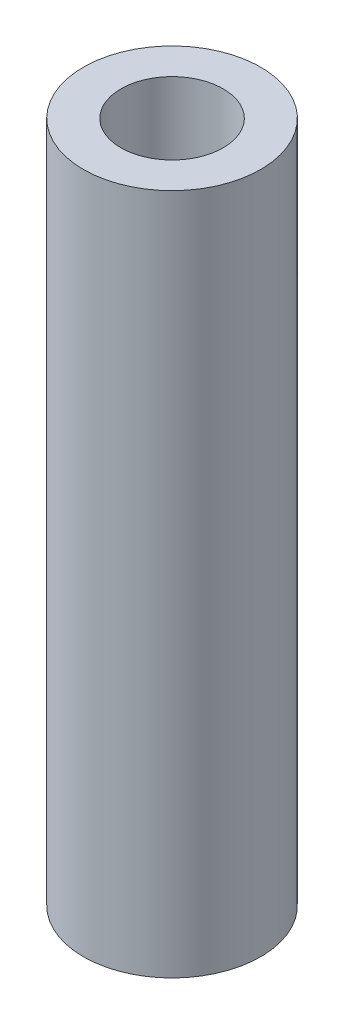
ISO-10303-21;
HEADER;
FILE_DESCRIPTION(('STEP AP214'),'2;1');
FILE_NAME('part.step','',(''),(''),'','','');
FILE_SCHEMA(('AUTOMOTIVE_DESIGN { 1 0 10303 214 1 1 1 1 }'));
ENDSEC;
DATA;
#1=APPLICATION_CONTEXT('core data for automotive mechanical design processes');
#2=APPLICATION_PROTOCOL_DEFINITION('international standard','automotive_design',2000,#1);
#3=PRODUCT_CONTEXT('',#1,'mechanical');
#4=PRODUCT('Part','Part','',(#3));
#5=PRODUCT_RELATED_PRODUCT_CATEGORY('part','',(#4));
#6=PRODUCT_DEFINITION_FORMATION('','',#4);
#7=PRODUCT_DEFINITION_CONTEXT('part definition',#1,'design');
#8=PRODUCT_DEFINITION('design','',#6,#7);
#9=PRODUCT_DEFINITION_SHAPE('','',#8);
#10=(LENGTH_UNIT() NAMED_UNIT(*) SI_UNIT(.MILLI.,.METRE.));
#11=(NAMED_UNIT(*) PLANE_ANGLE_UNIT() SI_UNIT($,.RADIAN.));
#12=(NAMED_UNIT(*) SI_UNIT($,.STERADIAN.) SOLID_ANGLE_UNIT());
#13=UNCERTAINTY_MEASURE_WITH_UNIT(LENGTH_MEASURE(1.E-05),#10,'distance_accuracy_value','');
#14=(GEOMETRIC_REPRESENTATION_CONTEXT(3) GLOBAL_UNCERTAINTY_ASSIGNED_CONTEXT((#13)) GLOBAL_UNIT_ASSIGNED_CONTEXT((#10,
#11,#12)) REPRESENTATION_CONTEXT('',''));
#15=CARTESIAN_POINT('',(0.,0.,0.));
#16=DIRECTION('',(0.,0.,1.));
#17=DIRECTION('',(1.,0.,0.));
#18=AXIS2_PLACEMENT_3D('',#15,#16,#17);
#19=CARTESIAN_POINT('',(0.,20.,0.));
#20=DIRECTION('',(0.,1.,0.));
#21=DIRECTION('',(0.,0.,1.));
#22=AXIS2_PLACEMENT_3D('',#19,#20,#21);
#23=PLANE('',#22);
#24=CARTESIAN_POINT('',(0.,20.,0.));
#25=DIRECTION('',(0.,1.,0.));
#26=DIRECTION('',(0.,0.,1.));
#27=AXIS2_PLACEMENT_3D('',#24,#25,#26);
#28=CIRCLE('',#27,2.6);
#29=CARTESIAN_POINT('',(0.,20.,2.6));
#30=VERTEX_POINT('',#29);
#31=EDGE_CURVE('E10',#30,#30,#28,.T.);
#32=ORIENTED_EDGE('',*,*,#31,.T.);
#33=EDGE_LOOP('',(#32));
#34=FACE_BOUND('',#33,.T.);
#35=CARTESIAN_POINT('',(0.,20.,0.));
#36=DIRECTION('',(0.,1.,0.));
#37=DIRECTION('',(0.,0.,1.));
#38=AXIS2_PLACEMENT_3D('',#35,#36,#37);
#39=CIRCLE('',#38,1.5);
#40=CARTESIAN_POINT('',(0.,20.,1.5));
#41=VERTEX_POINT('',#40);
#42=EDGE_CURVE('E54',#41,#41,#39,.T.);
#43=ORIENTED_EDGE('',*,*,#42,.F.);
#44=EDGE_LOOP('',(#43));
#45=FACE_BOUND('',#44,.T.);
#46=ADVANCED_FACE('F43',(#34,#45),#23,.T.);
#47=CARTESIAN_POINT('',(0.,0.,0.));
#48=DIRECTION('',(0.,1.,0.));
#49=DIRECTION('',(0.,0.,1.));
#50=AXIS2_PLACEMENT_3D('',#47,#48,#49);
#51=PLANE('',#50);
#52=CARTESIAN_POINT('',(0.,0.,0.));
#53=DIRECTION('',(0.,1.,0.));
#54=DIRECTION('',(0.,0.,1.));
#55=AXIS2_PLACEMENT_3D('',#52,#53,#54);
#56=CIRCLE('',#55,2.6);
#57=CARTESIAN_POINT('',(0.,0.,2.6));
#58=VERTEX_POINT('',#57);
#59=EDGE_CURVE('E47',#58,#58,#56,.T.);
#60=ORIENTED_EDGE('',*,*,#59,.F.);
#61=EDGE_LOOP('',(#60));
#62=FACE_BOUND('',#61,.T.);
#63=CARTESIAN_POINT('',(0.,0.,0.));
#64=DIRECTION('',(0.,1.,0.));
#65=DIRECTION('',(0.,0.,1.));
#66=AXIS2_PLACEMENT_3D('',#63,#64,#65);
#67=CIRCLE('',#66,1.5);
#68=CARTESIAN_POINT('',(0.,0.,1.5));
#69=VERTEX_POINT('',#68);
#70=EDGE_CURVE('E56',#69,#69,#67,.T.);
#71=ORIENTED_EDGE('',*,*,#70,.T.);
#72=EDGE_LOOP('',(#71));
#73=FACE_BOUND('',#72,.T.);
#74=ADVANCED_FACE('F66',(#62,#73),#51,.F.);
#75=CARTESIAN_POINT('',(0.,20.,0.));
#76=DIRECTION('',(0.,-1.,0.));
#77=DIRECTION('',(0.,0.,-1.));
#78=AXIS2_PLACEMENT_3D('',#75,#76,#77);
#79=CYLINDRICAL_SURFACE('',#78,2.6);
#80=ORIENTED_EDGE('',*,*,#31,.F.);
#81=EDGE_LOOP('',(#80));
#82=FACE_BOUND('',#81,.T.);
#83=ORIENTED_EDGE('',*,*,#59,.T.);
#84=EDGE_LOOP('',(#83));
#85=FACE_BOUND('',#84,.T.);
#86=ADVANCED_FACE('F45',(#82,#85),#79,.T.);
#87=CARTESIAN_POINT('',(0.,20.,0.));
#88=DIRECTION('',(0.,-1.,0.));
#89=DIRECTION('',(0.,0.,-1.));
#90=AXIS2_PLACEMENT_3D('',#87,#88,#89);
#91=CYLINDRICAL_SURFACE('',#90,1.5);
#92=ORIENTED_EDGE('',*,*,#42,.T.);
#93=EDGE_LOOP('',(#92));
#94=FACE_BOUND('',#93,.T.);
#95=ORIENTED_EDGE('',*,*,#70,.F.);
#96=EDGE_LOOP('',(#95));
#97=FACE_BOUND('',#96,.T.);
#98=ADVANCED_FACE('F62',(#94,#97),#91,.F.);
#99=CLOSED_SHELL('',(#46,#74,#86,#98));
#100=MANIFOLD_SOLID_BREP('B2',#99);
#101=ADVANCED_BREP_SHAPE_REPRESENTATION('',(#18,#100),#14);
#102=SHAPE_DEFINITION_REPRESENTATION(#9,#101);
ENDSEC;
END-ISO-10303-21;
